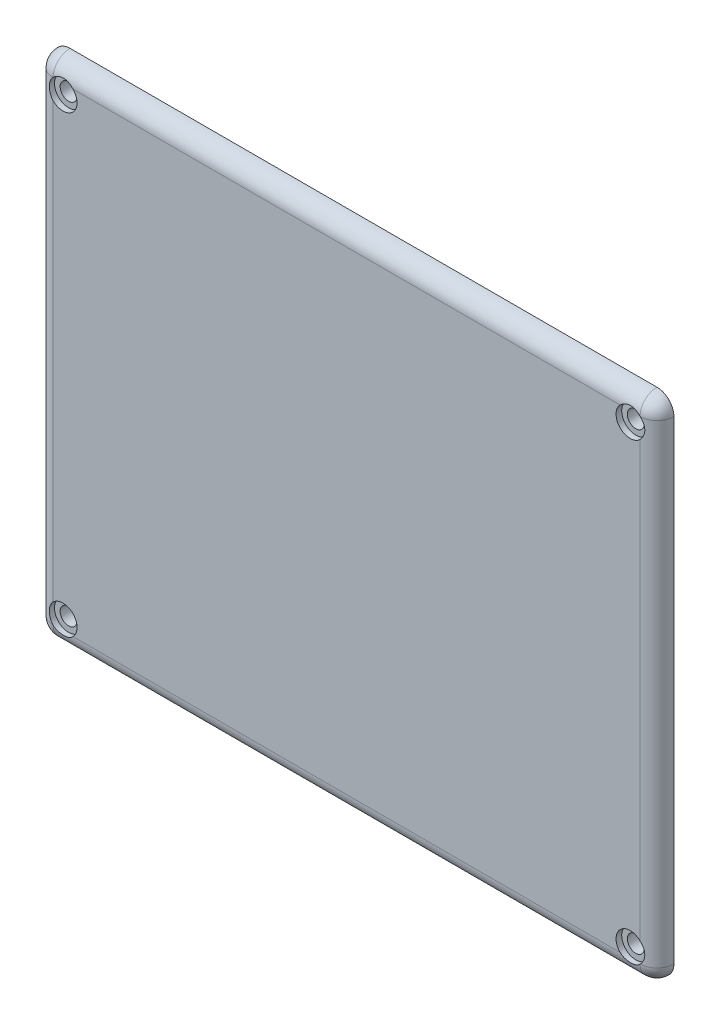
ISO-10303-21;
HEADER;
FILE_DESCRIPTION(('STEP AP214'),'2;1');
FILE_NAME('part.step','',(''),(''),'','','');
FILE_SCHEMA(('AUTOMOTIVE_DESIGN { 1 0 10303 214 1 1 1 1 }'));
ENDSEC;
DATA;
#1=APPLICATION_CONTEXT('core data for automotive mechanical design processes');
#2=APPLICATION_PROTOCOL_DEFINITION('international standard','automotive_design',2000,#1);
#3=PRODUCT_CONTEXT('',#1,'mechanical');
#4=PRODUCT('Part','Part','',(#3));
#5=PRODUCT_RELATED_PRODUCT_CATEGORY('part','',(#4));
#6=PRODUCT_DEFINITION_FORMATION('','',#4);
#7=PRODUCT_DEFINITION_CONTEXT('part definition',#1,'design');
#8=PRODUCT_DEFINITION('design','',#6,#7);
#9=PRODUCT_DEFINITION_SHAPE('','',#8);
#10=(LENGTH_UNIT() NAMED_UNIT(*) SI_UNIT(.MILLI.,.METRE.));
#11=(NAMED_UNIT(*) PLANE_ANGLE_UNIT() SI_UNIT($,.RADIAN.));
#12=(NAMED_UNIT(*) SI_UNIT($,.STERADIAN.) SOLID_ANGLE_UNIT());
#13=UNCERTAINTY_MEASURE_WITH_UNIT(LENGTH_MEASURE(1.E-05),#10,'distance_accuracy_value','');
#14=(GEOMETRIC_REPRESENTATION_CONTEXT(3) GLOBAL_UNCERTAINTY_ASSIGNED_CONTEXT((#13)) GLOBAL_UNIT_ASSIGNED_CONTEXT((#10,
#11,#12)) REPRESENTATION_CONTEXT('',''));
#15=CARTESIAN_POINT('',(0.,0.,0.));
#16=DIRECTION('',(0.,0.,1.));
#17=DIRECTION('',(1.,0.,0.));
#18=AXIS2_PLACEMENT_3D('',#15,#16,#17);
#19=CARTESIAN_POINT('',(-50.25,40.25,0.));
#20=DIRECTION('',(0.,0.,1.));
#21=DIRECTION('',(1.,0.,0.));
#22=AXIS2_PLACEMENT_3D('',#19,#20,#21);
#23=CYLINDRICAL_SURFACE('',#22,1.5);
#24=CARTESIAN_POINT('',(-50.25,40.25,0.));
#25=DIRECTION('',(0.,0.,1.));
#26=DIRECTION('',(1.,0.,0.));
#27=AXIS2_PLACEMENT_3D('',#24,#25,#26);
#28=CIRCLE('',#27,1.5);
#29=CARTESIAN_POINT('',(-48.75,40.25,0.));
#30=VERTEX_POINT('',#29);
#31=EDGE_CURVE('E181',#30,#30,#28,.T.);
#32=ORIENTED_EDGE('',*,*,#31,.F.);
#33=EDGE_LOOP('',(#32));
#34=FACE_BOUND('',#33,.T.);
#35=CARTESIAN_POINT('',(-50.25,40.25,2.));
#36=DIRECTION('',(0.,0.,1.));
#37=DIRECTION('',(1.,0.,0.));
#38=AXIS2_PLACEMENT_3D('',#35,#36,#37);
#39=CIRCLE('',#38,1.5);
#40=CARTESIAN_POINT('',(-48.75,40.25,2.));
#41=VERTEX_POINT('',#40);
#42=EDGE_CURVE('E218',#41,#41,#39,.F.);
#43=ORIENTED_EDGE('',*,*,#42,.F.);
#44=EDGE_LOOP('',(#43));
#45=FACE_BOUND('',#44,.T.);
#46=ADVANCED_FACE('F39',(#34,#45),#23,.F.);
#47=CARTESIAN_POINT('',(50.25,-40.25,0.));
#48=DIRECTION('',(0.,0.,1.));
#49=DIRECTION('',(1.,0.,0.));
#50=AXIS2_PLACEMENT_3D('',#47,#48,#49);
#51=CYLINDRICAL_SURFACE('',#50,1.5);
#52=CARTESIAN_POINT('',(50.25,-40.25,0.));
#53=DIRECTION('',(0.,0.,1.));
#54=DIRECTION('',(1.,0.,0.));
#55=AXIS2_PLACEMENT_3D('',#52,#53,#54);
#56=CIRCLE('',#55,1.5);
#57=CARTESIAN_POINT('',(51.75,-40.25,0.));
#58=VERTEX_POINT('',#57);
#59=EDGE_CURVE('E416',#58,#58,#56,.T.);
#60=ORIENTED_EDGE('',*,*,#59,.F.);
#61=EDGE_LOOP('',(#60));
#62=FACE_BOUND('',#61,.T.);
#63=CARTESIAN_POINT('',(50.25,-40.25,2.));
#64=DIRECTION('',(0.,0.,1.));
#65=DIRECTION('',(1.,0.,0.));
#66=AXIS2_PLACEMENT_3D('',#63,#64,#65);
#67=CIRCLE('',#66,1.5);
#68=CARTESIAN_POINT('',(51.75,-40.25,2.));
#69=VERTEX_POINT('',#68);
#70=EDGE_CURVE('E214',#69,#69,#67,.F.);
#71=ORIENTED_EDGE('',*,*,#70,.F.);
#72=EDGE_LOOP('',(#71));
#73=FACE_BOUND('',#72,.T.);
#74=ADVANCED_FACE('F309',(#62,#73),#51,.F.);
#75=CARTESIAN_POINT('',(-50.25,-40.25,0.));
#76=DIRECTION('',(0.,0.,1.));
#77=DIRECTION('',(1.,0.,0.));
#78=AXIS2_PLACEMENT_3D('',#75,#76,#77);
#79=CYLINDRICAL_SURFACE('',#78,1.5);
#80=CARTESIAN_POINT('',(-50.25,-40.25,0.));
#81=DIRECTION('',(0.,0.,1.));
#82=DIRECTION('',(1.,0.,0.));
#83=AXIS2_PLACEMENT_3D('',#80,#81,#82);
#84=CIRCLE('',#83,1.5);
#85=CARTESIAN_POINT('',(-48.75,-40.25,0.));
#86=VERTEX_POINT('',#85);
#87=EDGE_CURVE('E419',#86,#86,#84,.T.);
#88=ORIENTED_EDGE('',*,*,#87,.F.);
#89=EDGE_LOOP('',(#88));
#90=FACE_BOUND('',#89,.T.);
#91=CARTESIAN_POINT('',(-50.25,-40.25,2.));
#92=DIRECTION('',(0.,0.,1.));
#93=DIRECTION('',(1.,0.,0.));
#94=AXIS2_PLACEMENT_3D('',#91,#92,#93);
#95=CIRCLE('',#94,1.5);
#96=CARTESIAN_POINT('',(-48.75,-40.25,2.));
#97=VERTEX_POINT('',#96);
#98=EDGE_CURVE('E209',#97,#97,#95,.F.);
#99=ORIENTED_EDGE('',*,*,#98,.F.);
#100=EDGE_LOOP('',(#99));
#101=FACE_BOUND('',#100,.T.);
#102=ADVANCED_FACE('F403',(#90,#101),#79,.F.);
#103=CARTESIAN_POINT('',(50.25,40.25,0.));
#104=DIRECTION('',(0.,0.,1.));
#105=DIRECTION('',(1.,0.,0.));
#106=AXIS2_PLACEMENT_3D('',#103,#104,#105);
#107=CYLINDRICAL_SURFACE('',#106,1.5);
#108=CARTESIAN_POINT('',(50.25,40.25,0.));
#109=DIRECTION('',(0.,0.,1.));
#110=DIRECTION('',(1.,0.,0.));
#111=AXIS2_PLACEMENT_3D('',#108,#109,#110);
#112=CIRCLE('',#111,1.5);
#113=CARTESIAN_POINT('',(51.75,40.25,0.));
#114=VERTEX_POINT('',#113);
#115=EDGE_CURVE('E423',#114,#114,#112,.T.);
#116=ORIENTED_EDGE('',*,*,#115,.F.);
#117=EDGE_LOOP('',(#116));
#118=FACE_BOUND('',#117,.T.);
#119=CARTESIAN_POINT('',(50.25,40.25,2.));
#120=DIRECTION('',(0.,0.,1.));
#121=DIRECTION('',(1.,0.,0.));
#122=AXIS2_PLACEMENT_3D('',#119,#120,#121);
#123=CIRCLE('',#122,1.5);
#124=CARTESIAN_POINT('',(51.75,40.25,2.));
#125=VERTEX_POINT('',#124);
#126=EDGE_CURVE('E205',#125,#125,#123,.F.);
#127=ORIENTED_EDGE('',*,*,#126,.F.);
#128=EDGE_LOOP('',(#127));
#129=FACE_BOUND('',#128,.T.);
#130=ADVANCED_FACE('F409',(#118,#129),#107,.F.);
#131=CARTESIAN_POINT('',(52.,-42.,3.));
#132=DIRECTION('',(0.,0.,1.));
#133=DIRECTION('',(1.,0.,0.));
#134=AXIS2_PLACEMENT_3D('',#131,#132,#133);
#135=PLANE('',#134);
#136=CARTESIAN_POINT('',(50.25,40.25,3.));
#137=DIRECTION('',(0.,0.,1.));
#138=DIRECTION('',(1.,0.,0.));
#139=AXIS2_PLACEMENT_3D('',#136,#137,#138);
#140=CIRCLE('',#139,2.5);
#141=CARTESIAN_POINT('',(48.4646428928643,42.,3.));
#142=VERTEX_POINT('',#141);
#143=CARTESIAN_POINT('',(52.,38.4646428928643,3.));
#144=VERTEX_POINT('',#143);
#145=EDGE_CURVE('E69',#142,#144,#140,.T.);
#146=ORIENTED_EDGE('',*,*,#145,.F.);
#147=DIRECTION('',(-1.,0.,0.));
#148=VECTOR('',#147,1.);
#149=CARTESIAN_POINT('',(-52.,42.,3.));
#150=LINE('',#149,#148);
#151=CARTESIAN_POINT('',(-48.4646428928643,42.,3.));
#152=VERTEX_POINT('',#151);
#153=EDGE_CURVE('E149',#142,#152,#150,.T.);
#154=ORIENTED_EDGE('',*,*,#153,.T.);
#155=CARTESIAN_POINT('',(-50.25,40.25,3.));
#156=DIRECTION('',(0.,0.,1.));
#157=DIRECTION('',(1.,0.,0.));
#158=AXIS2_PLACEMENT_3D('',#155,#156,#157);
#159=CIRCLE('',#158,2.5);
#160=CARTESIAN_POINT('',(-52.,38.4646428928643,3.));
#161=VERTEX_POINT('',#160);
#162=EDGE_CURVE('E262',#161,#152,#159,.T.);
#163=ORIENTED_EDGE('',*,*,#162,.F.);
#164=DIRECTION('',(0.,-1.,0.));
#165=VECTOR('',#164,1.);
#166=CARTESIAN_POINT('',(-52.,-42.,3.));
#167=LINE('',#166,#165);
#168=CARTESIAN_POINT('',(-52.,-38.4646428928643,3.));
#169=VERTEX_POINT('',#168);
#170=EDGE_CURVE('E161',#161,#169,#167,.T.);
#171=ORIENTED_EDGE('',*,*,#170,.T.);
#172=CARTESIAN_POINT('',(-50.25,-40.25,3.));
#173=DIRECTION('',(0.,0.,1.));
#174=DIRECTION('',(1.,0.,0.));
#175=AXIS2_PLACEMENT_3D('',#172,#173,#174);
#176=CIRCLE('',#175,2.5);
#177=CARTESIAN_POINT('',(-48.4646428928643,-42.,3.));
#178=VERTEX_POINT('',#177);
#179=EDGE_CURVE('E358',#178,#169,#176,.T.);
#180=ORIENTED_EDGE('',*,*,#179,.F.);
#181=DIRECTION('',(1.,0.,0.));
#182=VECTOR('',#181,1.);
#183=CARTESIAN_POINT('',(52.,-42.,3.));
#184=LINE('',#183,#182);
#185=CARTESIAN_POINT('',(48.4646428928643,-42.,3.));
#186=VERTEX_POINT('',#185);
#187=EDGE_CURVE('E166',#178,#186,#184,.T.);
#188=ORIENTED_EDGE('',*,*,#187,.T.);
#189=CARTESIAN_POINT('',(50.25,-40.25,3.));
#190=DIRECTION('',(0.,0.,1.));
#191=DIRECTION('',(1.,0.,0.));
#192=AXIS2_PLACEMENT_3D('',#189,#190,#191);
#193=CIRCLE('',#192,2.5);
#194=CARTESIAN_POINT('',(52.,-38.4646428928643,3.));
#195=VERTEX_POINT('',#194);
#196=EDGE_CURVE('E374',#195,#186,#193,.T.);
#197=ORIENTED_EDGE('',*,*,#196,.F.);
#198=DIRECTION('',(0.,1.,0.));
#199=VECTOR('',#198,1.);
#200=CARTESIAN_POINT('',(52.,42.,3.));
#201=LINE('',#200,#199);
#202=EDGE_CURVE('E152',#195,#144,#201,.T.);
#203=ORIENTED_EDGE('',*,*,#202,.T.);
#204=EDGE_LOOP('',(#146,#154,#163,#171,#180,#188,#197,#203));
#205=FACE_BOUND('',#204,.T.);
#206=ADVANCED_FACE('F147',(#205),#135,.T.);
#207=CARTESIAN_POINT('',(52.,-42.,0.));
#208=DIRECTION('',(0.,0.,1.));
#209=DIRECTION('',(1.,0.,0.));
#210=AXIS2_PLACEMENT_3D('',#207,#208,#209);
#211=PLANE('',#210);
#212=ORIENTED_EDGE('',*,*,#115,.T.);
#213=EDGE_LOOP('',(#212));
#214=FACE_BOUND('',#213,.T.);
#215=ORIENTED_EDGE('',*,*,#87,.T.);
#216=EDGE_LOOP('',(#215));
#217=FACE_BOUND('',#216,.T.);
#218=ORIENTED_EDGE('',*,*,#59,.T.);
#219=EDGE_LOOP('',(#218));
#220=FACE_BOUND('',#219,.T.);
#221=ORIENTED_EDGE('',*,*,#31,.T.);
#222=EDGE_LOOP('',(#221));
#223=FACE_BOUND('',#222,.T.);
#224=CARTESIAN_POINT('',(52.,-42.,0.));
#225=DIRECTION('',(0.,0.,1.));
#226=DIRECTION('',(1.,0.,0.));
#227=AXIS2_PLACEMENT_3D('',#224,#225,#226);
#228=CIRCLE('',#227,3.);
#229=CARTESIAN_POINT('',(52.,-45.,0.));
#230=VERTEX_POINT('',#229);
#231=CARTESIAN_POINT('',(55.,-42.,0.));
#232=VERTEX_POINT('',#231);
#233=EDGE_CURVE('E204',#230,#232,#228,.T.);
#234=ORIENTED_EDGE('',*,*,#233,.F.);
#235=DIRECTION('',(1.,0.,0.));
#236=VECTOR('',#235,1.);
#237=CARTESIAN_POINT('',(52.,-45.,0.));
#238=LINE('',#237,#236);
#239=CARTESIAN_POINT('',(-52.,-45.,0.));
#240=VERTEX_POINT('',#239);
#241=EDGE_CURVE('E168',#240,#230,#238,.T.);
#242=ORIENTED_EDGE('',*,*,#241,.F.);
#243=CARTESIAN_POINT('',(-52.,-42.,0.));
#244=DIRECTION('',(0.,0.,1.));
#245=DIRECTION('',(-1.,0.,0.));
#246=AXIS2_PLACEMENT_3D('',#243,#244,#245);
#247=CIRCLE('',#246,3.);
#248=CARTESIAN_POINT('',(-55.,-42.,0.));
#249=VERTEX_POINT('',#248);
#250=EDGE_CURVE('E452',#249,#240,#247,.T.);
#251=ORIENTED_EDGE('',*,*,#250,.F.);
#252=DIRECTION('',(0.,-1.,0.));
#253=VECTOR('',#252,1.);
#254=CARTESIAN_POINT('',(-55.,-42.,0.));
#255=LINE('',#254,#253);
#256=CARTESIAN_POINT('',(-55.,42.,0.));
#257=VERTEX_POINT('',#256);
#258=EDGE_CURVE('E448',#257,#249,#255,.T.);
#259=ORIENTED_EDGE('',*,*,#258,.F.);
#260=CARTESIAN_POINT('',(-52.,42.,0.));
#261=DIRECTION('',(0.,0.,1.));
#262=DIRECTION('',(1.,0.,0.));
#263=AXIS2_PLACEMENT_3D('',#260,#261,#262);
#264=CIRCLE('',#263,3.);
#265=CARTESIAN_POINT('',(-52.,45.,0.));
#266=VERTEX_POINT('',#265);
#267=EDGE_CURVE('E444',#266,#257,#264,.T.);
#268=ORIENTED_EDGE('',*,*,#267,.F.);
#269=DIRECTION('',(-1.,0.,0.));
#270=VECTOR('',#269,1.);
#271=CARTESIAN_POINT('',(52.,45.,0.));
#272=LINE('',#271,#270);
#273=CARTESIAN_POINT('',(52.,45.,0.));
#274=VERTEX_POINT('',#273);
#275=EDGE_CURVE('E440',#274,#266,#272,.T.);
#276=ORIENTED_EDGE('',*,*,#275,.F.);
#277=CARTESIAN_POINT('',(52.,42.,0.));
#278=DIRECTION('',(0.,0.,1.));
#279=DIRECTION('',(1.,0.,0.));
#280=AXIS2_PLACEMENT_3D('',#277,#278,#279);
#281=CIRCLE('',#280,3.);
#282=CARTESIAN_POINT('',(55.,42.,0.));
#283=VERTEX_POINT('',#282);
#284=EDGE_CURVE('E436',#283,#274,#281,.T.);
#285=ORIENTED_EDGE('',*,*,#284,.F.);
#286=DIRECTION('',(0.,1.,0.));
#287=VECTOR('',#286,1.);
#288=CARTESIAN_POINT('',(55.,-42.,0.));
#289=LINE('',#288,#287);
#290=EDGE_CURVE('E379',#232,#283,#289,.T.);
#291=ORIENTED_EDGE('',*,*,#290,.F.);
#292=EDGE_LOOP('',(#234,#242,#251,#259,#268,#276,#285,#291));
#293=FACE_BOUND('',#292,.T.);
#294=ADVANCED_FACE('F459',(#214,#217,#220,#223,#293),#211,.F.);
#295=CARTESIAN_POINT('',(52.,42.,0.));
#296=DIRECTION('',(1.,0.,0.));
#297=DIRECTION('',(0.,1.,0.));
#298=AXIS2_PLACEMENT_3D('',#295,#296,#297);
#299=CYLINDRICAL_SURFACE('',#298,3.);
#300=CARTESIAN_POINT('',(52.,42.0353571071358,2.99979163859342));
#301=CARTESIAN_POINT('',(51.9500608667865,42.0843086142766,2.99921283319864));
#302=CARTESIAN_POINT('',(51.8981087732692,42.1311200953269,2.99746505774805));
#303=CARTESIAN_POINT('',(51.7905442012112,42.2201773753236,2.9922419543179));
#304=CARTESIAN_POINT('',(51.7349333149871,42.2624251395385,2.98876737359001));
#305=CARTESIAN_POINT('',(51.5632057627769,42.3818770152372,2.97667351385794));
#306=CARTESIAN_POINT('',(51.4420943301581,42.451887312441,2.96638056967047));
#307=CARTESIAN_POINT('',(51.1900485098685,42.5707188927066,2.9458336116721));
#308=CARTESIAN_POINT('',(51.0591195788686,42.6195518454636,2.93557957951486));
#309=CARTESIAN_POINT('',(50.7907828370971,42.694777132051,2.91869572322499));
#310=CARTESIAN_POINT('',(50.6533792355575,42.7211838385826,2.91206357884415));
#311=CARTESIAN_POINT('',(50.375820665212,42.7507320370624,2.90459041397906));
#312=CARTESIAN_POINT('',(50.2356637535903,42.7538564624348,2.90375364169945));
#313=CARTESIAN_POINT('',(49.9568403102323,42.7366792053536,2.90815683749415));
#314=CARTESIAN_POINT('',(49.8181743899507,42.7163682561252,2.91339920937713));
#315=CARTESIAN_POINT('',(49.5493494902657,42.6536939622346,2.92808440859298));
#316=CARTESIAN_POINT('',(49.4190718569742,42.6118128122909,2.93743475777256));
#317=CARTESIAN_POINT('',(49.1672000307541,42.507456039875,2.95724396602515));
#318=CARTESIAN_POINT('',(49.0456005060231,42.4449931975882,2.96770213447116));
#319=CARTESIAN_POINT('',(48.8453265694204,42.3204596204108,2.98330383209881));
#320=CARTESIAN_POINT('',(48.7639187154389,42.2628244218602,2.98912003323493));
#321=CARTESIAN_POINT('',(48.6084854939142,42.138219611078,2.99746193801563));
#322=CARTESIAN_POINT('',(48.5344565651145,42.0712545394654,2.99998923613827));
#323=CARTESIAN_POINT('',(48.4646428928643,42.,3.));
#324=B_SPLINE_CURVE_WITH_KNOTS('',3,(#300,#301,#302,#303,#304,#305,#306,#307,#308,#309,#310,
#311,#312,#313,#314,#315,#316,#317,#318,#319,#320,#321,#322,#323),.UNSPECIFIED.,.F.,.F.,(4,2,2,
2,2,2,2,2,2,2,2,4),(0.,0.209634674418098,0.41917871114687,0.837853242513011,1.2562967708046,
1.67447192105002,2.0929535754741,2.51160076190603,2.9212711490543,3.33068762958752,
3.6297108007777,3.92858894983611),.UNSPECIFIED.);
#325=CARTESIAN_POINT('',(52.,42.0353571071358,2.99979163859342));
#326=VERTEX_POINT('',#325);
#327=EDGE_CURVE('E133',#326,#142,#324,.T.);
#328=ORIENTED_EDGE('',*,*,#327,.F.);
#329=CARTESIAN_POINT('',(52.,42.,0.));
#330=DIRECTION('',(1.,0.,0.));
#331=DIRECTION('',(0.,0.,-1.));
#332=AXIS2_PLACEMENT_3D('',#329,#330,#331);
#333=CIRCLE('',#332,3.);
#334=EDGE_CURVE('E198',#274,#326,#333,.T.);
#335=ORIENTED_EDGE('',*,*,#334,.F.);
#336=ORIENTED_EDGE('',*,*,#275,.T.);
#337=CARTESIAN_POINT('',(-52.,42.,0.));
#338=DIRECTION('',(-1.,0.,0.));
#339=DIRECTION('',(0.,-1.,0.));
#340=AXIS2_PLACEMENT_3D('',#337,#338,#339);
#341=CIRCLE('',#340,3.);
#342=CARTESIAN_POINT('',(-52.,42.0353571071357,2.99979163859342));
#343=VERTEX_POINT('',#342);
#344=EDGE_CURVE('E201',#343,#266,#341,.T.);
#345=ORIENTED_EDGE('',*,*,#344,.F.);
#346=CARTESIAN_POINT('',(-48.4646428928643,42.,3.));
#347=CARTESIAN_POINT('',(-48.5134814324364,42.0498274806495,2.99999859619542));
#348=CARTESIAN_POINT('',(-48.5643727016704,42.0975703499416,2.99875907176475));
#349=CARTESIAN_POINT('',(-48.6698930094224,42.1885859534983,2.99441325796732));
#350=CARTESIAN_POINT('',(-48.7245202203606,42.2318608478081,2.99130787564966));
#351=CARTESIAN_POINT('',(-48.8933869769346,42.3544991361097,2.98011344457929));
#352=CARTESIAN_POINT('',(-49.0127365670675,42.4268031957028,2.97014303498068));
#353=CARTESIAN_POINT('',(-49.2615731305192,42.5505065597071,2.94972736978609));
#354=CARTESIAN_POINT('',(-49.3910520358303,42.6019223035257,2.9392824948278));
#355=CARTESIAN_POINT('',(-49.6569233553629,42.6825969578046,2.92160568474614));
#356=CARTESIAN_POINT('',(-49.7933122297122,42.7118670930838,2.91437212269219));
#357=CARTESIAN_POINT('',(-50.0700654908009,42.7474385749668,2.90545838599251));
#358=CARTESIAN_POINT('',(-50.210448486436,42.7536043592303,2.90381099294785));
#359=CARTESIAN_POINT('',(-50.4902421287338,42.7423663449879,2.90670289565939));
#360=CARTESIAN_POINT('',(-50.6296524798289,42.7249556709676,2.91124399614529));
#361=CARTESIAN_POINT('',(-50.8999941658302,42.6678797580177,2.92485152913564));
#362=CARTESIAN_POINT('',(-51.031049387737,42.6287678733732,2.93380484461675));
#363=CARTESIAN_POINT('',(-51.2849051506309,42.5298058488742,2.95327481733971));
#364=CARTESIAN_POINT('',(-51.4077097797255,42.46996607138,2.96379069192439));
#365=CARTESIAN_POINT('',(-51.6109194430326,42.3495026576022,2.98001480213467));
#366=CARTESIAN_POINT('',(-51.6939296176434,42.2932987188332,2.98625835478941));
#367=CARTESIAN_POINT('',(-51.8526759549534,42.1713191008928,2.9957254556576));
#368=CARTESIAN_POINT('',(-51.9284170478255,42.105549986444,2.9989510639353));
#369=CARTESIAN_POINT('',(-52.,42.0353571071357,2.99979163859342));
#370=B_SPLINE_CURVE_WITH_KNOTS('',3,(#346,#347,#348,#349,#350,#351,#352,#353,#354,#355,#356,
#357,#358,#359,#360,#361,#362,#363,#364,#365,#366,#367,#368,#369),.UNSPECIFIED.,.F.,.F.,(4,2,2,
2,2,2,2,2,2,2,2,4),(0.,0.209148934394972,0.418196277433579,0.835763446092833,1.25300134372409,
1.67002761640909,2.08949694952745,2.50908863726791,2.91844270039925,3.32759241247429,
3.62819506443365,3.92859237346132),.UNSPECIFIED.);
#371=EDGE_CURVE('E159',#152,#343,#370,.T.);
#372=ORIENTED_EDGE('',*,*,#371,.F.);
#373=ORIENTED_EDGE('',*,*,#153,.F.);
#374=EDGE_LOOP('',(#328,#335,#336,#345,#372,#373));
#375=FACE_BOUND('',#374,.T.);
#376=ADVANCED_FACE('F41',(#375),#299,.T.);
#377=CARTESIAN_POINT('',(-52.,42.,0.));
#378=DIRECTION('',(0.,0.,1.));
#379=DIRECTION('',(1.,0.,0.));
#380=AXIS2_PLACEMENT_3D('',#377,#378,#379);
#381=SPHERICAL_SURFACE('',#380,3.);
#382=CARTESIAN_POINT('',(-51.9998,42.0355531243848,2.99978931515973));
#383=CARTESIAN_POINT('',(-52.0058191145801,42.0296545308366,2.99985962279687));
#384=CARTESIAN_POINT('',(-52.0118080989023,42.0237258070305,2.99989477661544));
#385=CARTESIAN_POINT('',(-52.0237258070305,42.0118080989022,2.99989477661544));
#386=CARTESIAN_POINT('',(-52.0296545308366,42.0058191145801,2.99985962279687));
#387=CARTESIAN_POINT('',(-52.0355531243848,41.9998,2.99978931515973));
#388=B_SPLINE_CURVE_WITH_KNOTS('',3,(#382,#383,#384,#385,#386,#387),.UNSPECIFIED.,.F.,.F.,(4,2,
4),(0.,0.0252818198462741,0.0505636396925482),.UNSPECIFIED.);
#389=CARTESIAN_POINT('',(-52.0353571071357,42.,2.99979163859342));
#390=VERTEX_POINT('',#389);
#391=EDGE_CURVE('E61',#343,#390,#388,.T.);
#392=ORIENTED_EDGE('',*,*,#391,.F.);
#393=ORIENTED_EDGE('',*,*,#344,.T.);
#394=ORIENTED_EDGE('',*,*,#267,.T.);
#395=CARTESIAN_POINT('',(-52.,42.,0.));
#396=DIRECTION('',(0.,-1.,0.));
#397=DIRECTION('',(1.,0.,0.));
#398=AXIS2_PLACEMENT_3D('',#395,#396,#397);
#399=CIRCLE('',#398,3.);
#400=EDGE_CURVE('E195',#390,#257,#399,.T.);
#401=ORIENTED_EDGE('',*,*,#400,.F.);
#402=EDGE_LOOP('',(#392,#393,#394,#401));
#403=FACE_BOUND('',#402,.T.);
#404=ADVANCED_FACE('F329',(#403),#381,.T.);
#405=CARTESIAN_POINT('',(52.,42.,0.));
#406=DIRECTION('',(0.,0.,1.));
#407=DIRECTION('',(1.,0.,0.));
#408=AXIS2_PLACEMENT_3D('',#405,#406,#407);
#409=SPHERICAL_SURFACE('',#408,3.);
#410=CARTESIAN_POINT('',(52.0355531243847,41.9998,2.99978931515973));
#411=CARTESIAN_POINT('',(52.0296545308366,42.0058191145801,2.99985962279687));
#412=CARTESIAN_POINT('',(52.0237258070305,42.0118080989023,2.99989477661544));
#413=CARTESIAN_POINT('',(52.0118080989023,42.0237258070305,2.99989477661544));
#414=CARTESIAN_POINT('',(52.0058191145801,42.0296545308366,2.99985962279687));
#415=CARTESIAN_POINT('',(51.9998,42.0355531243848,2.99978931515973));
#416=B_SPLINE_CURVE_WITH_KNOTS('',3,(#410,#411,#412,#413,#414,#415),.UNSPECIFIED.,.F.,.F.,(4,2,
4),(0.,0.0252818198462741,0.0505636396925384),.UNSPECIFIED.);
#417=CARTESIAN_POINT('',(52.0353571071358,42.,2.99979163859342));
#418=VERTEX_POINT('',#417);
#419=EDGE_CURVE('E137',#418,#326,#416,.T.);
#420=ORIENTED_EDGE('',*,*,#419,.F.);
#421=CARTESIAN_POINT('',(52.,42.,0.));
#422=DIRECTION('',(0.,-1.,0.));
#423=DIRECTION('',(1.,0.,0.));
#424=AXIS2_PLACEMENT_3D('',#421,#422,#423);
#425=CIRCLE('',#424,3.);
#426=EDGE_CURVE('E191',#283,#418,#425,.T.);
#427=ORIENTED_EDGE('',*,*,#426,.F.);
#428=ORIENTED_EDGE('',*,*,#284,.T.);
#429=ORIENTED_EDGE('',*,*,#334,.T.);
#430=EDGE_LOOP('',(#420,#427,#428,#429));
#431=FACE_BOUND('',#430,.T.);
#432=ADVANCED_FACE('F333',(#431),#409,.T.);
#433=CARTESIAN_POINT('',(-52.,-42.,0.));
#434=DIRECTION('',(0.,1.,0.));
#435=DIRECTION('',(-1.,0.,0.));
#436=AXIS2_PLACEMENT_3D('',#433,#434,#435);
#437=CYLINDRICAL_SURFACE('',#436,3.);
#438=CARTESIAN_POINT('',(-52.,-38.4646428928643,3.));
#439=CARTESIAN_POINT('',(-52.0498274806495,-38.5134814324364,2.99999859619542));
#440=CARTESIAN_POINT('',(-52.0975703499416,-38.5643727016704,2.99875907176475));
#441=CARTESIAN_POINT('',(-52.1885859534984,-38.6698930094224,2.99441325796732));
#442=CARTESIAN_POINT('',(-52.2318608478081,-38.7245202203606,2.99130787564966));
#443=CARTESIAN_POINT('',(-52.3544991361097,-38.8933869769347,2.98011344457929));
#444=CARTESIAN_POINT('',(-52.4268031957028,-39.0127365670675,2.97014303498068));
#445=CARTESIAN_POINT('',(-52.5505065597071,-39.2615731305193,2.94972736978609));
#446=CARTESIAN_POINT('',(-52.6019223035257,-39.3910520358304,2.9392824948278));
#447=CARTESIAN_POINT('',(-52.6825969578046,-39.656923355363,2.92160568474614));
#448=CARTESIAN_POINT('',(-52.7118670930838,-39.7933122297123,2.91437212269219));
#449=CARTESIAN_POINT('',(-52.7474385749668,-40.0700654908009,2.90545838599252));
#450=CARTESIAN_POINT('',(-52.7536043592303,-40.2104484864361,2.90381099294786));
#451=CARTESIAN_POINT('',(-52.7423663449879,-40.4902421287339,2.9067028956594));
#452=CARTESIAN_POINT('',(-52.7249556709676,-40.6296524798289,2.91124399614531));
#453=CARTESIAN_POINT('',(-52.6678797580177,-40.8999941658303,2.92485152913565));
#454=CARTESIAN_POINT('',(-52.6287678733732,-41.0310493877371,2.93380484461676));
#455=CARTESIAN_POINT('',(-52.5298058488742,-41.2849051506309,2.95327481733972));
#456=CARTESIAN_POINT('',(-52.4699660713799,-41.4077097797256,2.9637906919244));
#457=CARTESIAN_POINT('',(-52.3495026576022,-41.6109194430326,2.98001480213468));
#458=CARTESIAN_POINT('',(-52.2932987188331,-41.6939296176435,2.98625835478942));
#459=CARTESIAN_POINT('',(-52.1713191008928,-41.8526759549534,2.9957254556576));
#460=CARTESIAN_POINT('',(-52.105549986444,-41.9284170478255,2.99895106393531));
#461=CARTESIAN_POINT('',(-52.0353571071357,-42.,2.99979163859342));
#462=B_SPLINE_CURVE_WITH_KNOTS('',3,(#438,#439,#440,#441,#442,#443,#444,#445,#446,#447,#448,
#449,#450,#451,#452,#453,#454,#455,#456,#457,#458,#459,#460,#461),.UNSPECIFIED.,.F.,.F.,(4,2,2,
2,2,2,2,2,2,2,2,4),(0.,0.209148934394967,0.418196277433571,0.83576344609284,1.25300134372412,
1.6700276164091,2.08949694952746,2.50908863726791,2.91844270039925,3.32759241247429,
3.62819506443362,3.92859237346127),.UNSPECIFIED.);
#463=CARTESIAN_POINT('',(-52.0353571071357,-42.,2.99979163859342));
#464=VERTEX_POINT('',#463);
#465=EDGE_CURVE('E288',#169,#464,#462,.T.);
#466=ORIENTED_EDGE('',*,*,#465,.F.);
#467=ORIENTED_EDGE('',*,*,#170,.F.);
#468=CARTESIAN_POINT('',(-52.0353571071358,42.,2.99979163859342));
#469=CARTESIAN_POINT('',(-52.0843086142765,41.9500608667865,2.99921283319864));
#470=CARTESIAN_POINT('',(-52.1311200953269,41.8981087732692,2.99746505774805));
#471=CARTESIAN_POINT('',(-52.2201773753236,41.7905442012112,2.99224195431791));
#472=CARTESIAN_POINT('',(-52.2624251395384,41.7349333149871,2.98876737359002));
#473=CARTESIAN_POINT('',(-52.3818770152372,41.5632057627769,2.97667351385795));
#474=CARTESIAN_POINT('',(-52.451887312441,41.4420943301581,2.96638056967047));
#475=CARTESIAN_POINT('',(-52.5707188927066,41.1900485098685,2.9458336116721));
#476=CARTESIAN_POINT('',(-52.6195518454636,41.0591195788686,2.93557957951487));
#477=CARTESIAN_POINT('',(-52.694777132051,40.7907828370971,2.91869572322499));
#478=CARTESIAN_POINT('',(-52.7211838385826,40.6533792355575,2.91206357884416));
#479=CARTESIAN_POINT('',(-52.7507320370624,40.375820665212,2.90459041397907));
#480=CARTESIAN_POINT('',(-52.7538564624348,40.2356637535903,2.90375364169945));
#481=CARTESIAN_POINT('',(-52.7366792053535,39.9568403102323,2.90815683749416));
#482=CARTESIAN_POINT('',(-52.7163682561252,39.8181743899507,2.91339920937713));
#483=CARTESIAN_POINT('',(-52.6536939622345,39.5493494902657,2.92808440859299));
#484=CARTESIAN_POINT('',(-52.6118128122909,39.4190718569742,2.93743475777256));
#485=CARTESIAN_POINT('',(-52.507456039875,39.1672000307541,2.95724396602515));
#486=CARTESIAN_POINT('',(-52.4449931975882,39.0456005060231,2.96770213447116));
#487=CARTESIAN_POINT('',(-52.3204596204108,38.8453265694204,2.98330383209881));
#488=CARTESIAN_POINT('',(-52.2628244218602,38.7639187154389,2.98912003323493));
#489=CARTESIAN_POINT('',(-52.138219611078,38.6084854939143,2.99746193801563));
#490=CARTESIAN_POINT('',(-52.0712545394654,38.5344565651146,2.99998923613827));
#491=CARTESIAN_POINT('',(-52.,38.4646428928643,3.));
#492=B_SPLINE_CURVE_WITH_KNOTS('',3,(#468,#469,#470,#471,#472,#473,#474,#475,#476,#477,#478,
#479,#480,#481,#482,#483,#484,#485,#486,#487,#488,#489,#490,#491),.UNSPECIFIED.,.F.,.F.,(4,2,2,
2,2,2,2,2,2,2,2,4),(0.,0.209634674418083,0.419178711146865,0.837853242513008,1.25629677080459,
1.67447192105002,2.0929535754741,2.51160076190602,2.9212711490543,3.33068762958752,
3.62971080077768,3.92858894983608),.UNSPECIFIED.);
#493=EDGE_CURVE('E11',#390,#161,#492,.T.);
#494=ORIENTED_EDGE('',*,*,#493,.F.);
#495=ORIENTED_EDGE('',*,*,#400,.T.);
#496=ORIENTED_EDGE('',*,*,#258,.T.);
#497=CARTESIAN_POINT('',(-52.,-42.,0.));
#498=DIRECTION('',(0.,-1.,0.));
#499=DIRECTION('',(0.,0.,-1.));
#500=AXIS2_PLACEMENT_3D('',#497,#498,#499);
#501=CIRCLE('',#500,3.);
#502=EDGE_CURVE('E188',#464,#249,#501,.T.);
#503=ORIENTED_EDGE('',*,*,#502,.F.);
#504=EDGE_LOOP('',(#466,#467,#494,#495,#496,#503));
#505=FACE_BOUND('',#504,.T.);
#506=ADVANCED_FACE('F337',(#505),#437,.T.);
#507=CARTESIAN_POINT('',(52.,-42.,0.));
#508=DIRECTION('',(0.,-1.,0.));
#509=DIRECTION('',(0.,0.,-1.));
#510=AXIS2_PLACEMENT_3D('',#507,#508,#509);
#511=CYLINDRICAL_SURFACE('',#510,3.);
#512=CARTESIAN_POINT('',(52.,38.4646428928643,3.));
#513=CARTESIAN_POINT('',(52.0498274806495,38.5134814324364,2.99999859619542));
#514=CARTESIAN_POINT('',(52.0975703499416,38.5643727016704,2.99875907176475));
#515=CARTESIAN_POINT('',(52.1885859534983,38.6698930094224,2.99441325796732));
#516=CARTESIAN_POINT('',(52.2318608478081,38.7245202203606,2.99130787564966));
#517=CARTESIAN_POINT('',(52.3544991361097,38.8933869769347,2.98011344457929));
#518=CARTESIAN_POINT('',(52.4268031957028,39.0127365670675,2.97014303498068));
#519=CARTESIAN_POINT('',(52.5505065597071,39.2615731305193,2.94972736978609));
#520=CARTESIAN_POINT('',(52.6019223035257,39.3910520358304,2.9392824948278));
#521=CARTESIAN_POINT('',(52.6825969578046,39.656923355363,2.92160568474614));
#522=CARTESIAN_POINT('',(52.7118670930838,39.7933122297123,2.91437212269219));
#523=CARTESIAN_POINT('',(52.7474385749668,40.0700654908009,2.90545838599252));
#524=CARTESIAN_POINT('',(52.7536043592303,40.210448486436,2.90381099294785));
#525=CARTESIAN_POINT('',(52.7423663449879,40.4902421287339,2.90670289565939));
#526=CARTESIAN_POINT('',(52.7249556709676,40.6296524798289,2.9112439961453));
#527=CARTESIAN_POINT('',(52.6678797580177,40.8999941658303,2.92485152913564));
#528=CARTESIAN_POINT('',(52.6287678733732,41.0310493877371,2.93380484461676));
#529=CARTESIAN_POINT('',(52.5298058488742,41.2849051506309,2.95327481733972));
#530=CARTESIAN_POINT('',(52.4699660713799,41.4077097797256,2.9637906919244));
#531=CARTESIAN_POINT('',(52.3495026576022,41.6109194430326,2.98001480213467));
#532=CARTESIAN_POINT('',(52.2932987188332,41.6939296176434,2.98625835478941));
#533=CARTESIAN_POINT('',(52.1713191008928,41.8526759549534,2.9957254556576));
#534=CARTESIAN_POINT('',(52.105549986444,41.9284170478255,2.9989510639353));
#535=CARTESIAN_POINT('',(52.0353571071358,42.,2.99979163859342));
#536=B_SPLINE_CURVE_WITH_KNOTS('',3,(#512,#513,#514,#515,#516,#517,#518,#519,#520,#521,#522,
#523,#524,#525,#526,#527,#528,#529,#530,#531,#532,#533,#534,#535),.UNSPECIFIED.,.F.,.F.,(4,2,2,
2,2,2,2,2,2,2,2,4),(0.,0.209148934394957,0.418196277433565,0.835763446092824,1.2530013437241,
1.67002761640908,2.08949694952744,2.50908863726789,2.91844270039924,3.32759241247428,
3.6281950644336,3.92859237346124),.UNSPECIFIED.);
#537=EDGE_CURVE('E55',#144,#418,#536,.T.);
#538=ORIENTED_EDGE('',*,*,#537,.F.);
#539=ORIENTED_EDGE('',*,*,#202,.F.);
#540=CARTESIAN_POINT('',(52.0353571071358,-42.,2.99979163859342));
#541=CARTESIAN_POINT('',(52.0843086142765,-41.9500608667865,2.99921283319864));
#542=CARTESIAN_POINT('',(52.1311200953269,-41.8981087732692,2.99746505774805));
#543=CARTESIAN_POINT('',(52.2201773753236,-41.7905442012112,2.9922419543179));
#544=CARTESIAN_POINT('',(52.2624251395384,-41.7349333149871,2.98876737359001));
#545=CARTESIAN_POINT('',(52.3818770152372,-41.5632057627769,2.97667351385794));
#546=CARTESIAN_POINT('',(52.451887312441,-41.442094330158,2.96638056967047));
#547=CARTESIAN_POINT('',(52.5707188927066,-41.1900485098684,2.9458336116721));
#548=CARTESIAN_POINT('',(52.6195518454636,-41.0591195788686,2.93557957951486));
#549=CARTESIAN_POINT('',(52.694777132051,-40.7907828370971,2.91869572322499));
#550=CARTESIAN_POINT('',(52.7211838385826,-40.6533792355575,2.91206357884415));
#551=CARTESIAN_POINT('',(52.7507320370624,-40.3758206652119,2.90459041397907));
#552=CARTESIAN_POINT('',(52.7538564624348,-40.2356637535903,2.90375364169945));
#553=CARTESIAN_POINT('',(52.7366792053535,-39.9568403102322,2.90815683749416));
#554=CARTESIAN_POINT('',(52.7163682561251,-39.8181743899507,2.91339920937713));
#555=CARTESIAN_POINT('',(52.6536939622345,-39.5493494902657,2.92808440859299));
#556=CARTESIAN_POINT('',(52.6118128122909,-39.4190718569742,2.93743475777256));
#557=CARTESIAN_POINT('',(52.507456039875,-39.1672000307541,2.95724396602515));
#558=CARTESIAN_POINT('',(52.4449931975882,-39.0456005060231,2.96770213447116));
#559=CARTESIAN_POINT('',(52.3204596204108,-38.8453265694204,2.98330383209881));
#560=CARTESIAN_POINT('',(52.2628244218602,-38.7639187154389,2.98912003323493));
#561=CARTESIAN_POINT('',(52.138219611078,-38.6084854939142,2.99746193801563));
#562=CARTESIAN_POINT('',(52.0712545394654,-38.5344565651145,2.99998923613827));
#563=CARTESIAN_POINT('',(52.,-38.4646428928643,3.));
#564=B_SPLINE_CURVE_WITH_KNOTS('',3,(#540,#541,#542,#543,#544,#545,#546,#547,#548,#549,#550,
#551,#552,#553,#554,#555,#556,#557,#558,#559,#560,#561,#562,#563),.UNSPECIFIED.,.F.,.F.,(4,2,2,
2,2,2,2,2,2,2,2,4),(0.,0.209634674418093,0.419178711146875,0.837853242513022,1.25629677080461,
1.67447192105004,2.09295357547411,2.51160076190604,2.92127114905431,3.33068762958753,
3.62971080077768,3.92858894983607),.UNSPECIFIED.);
#565=CARTESIAN_POINT('',(52.0353571071358,-42.,2.99979163859342));
#566=VERTEX_POINT('',#565);
#567=EDGE_CURVE('E261',#566,#195,#564,.T.);
#568=ORIENTED_EDGE('',*,*,#567,.F.);
#569=CARTESIAN_POINT('',(52.,-42.,0.));
#570=DIRECTION('',(0.,-1.,0.));
#571=DIRECTION('',(0.,0.,-1.));
#572=AXIS2_PLACEMENT_3D('',#569,#570,#571);
#573=CIRCLE('',#572,3.);
#574=EDGE_CURVE('E184',#232,#566,#573,.T.);
#575=ORIENTED_EDGE('',*,*,#574,.F.);
#576=ORIENTED_EDGE('',*,*,#290,.T.);
#577=ORIENTED_EDGE('',*,*,#426,.T.);
#578=EDGE_LOOP('',(#538,#539,#568,#575,#576,#577));
#579=FACE_BOUND('',#578,.T.);
#580=ADVANCED_FACE('F278',(#579),#511,.T.);
#581=CARTESIAN_POINT('',(-52.,-42.,0.));
#582=DIRECTION('',(0.,0.,1.));
#583=DIRECTION('',(1.,0.,0.));
#584=AXIS2_PLACEMENT_3D('',#581,#582,#583);
#585=SPHERICAL_SURFACE('',#584,3.);
#586=CARTESIAN_POINT('',(-52.0355531243847,-41.9998,2.99978931515973));
#587=CARTESIAN_POINT('',(-52.0296545308366,-42.0058191145801,2.99985962279687));
#588=CARTESIAN_POINT('',(-52.0237258070305,-42.0118080989023,2.99989477661544));
#589=CARTESIAN_POINT('',(-52.0118080989022,-42.0237258070305,2.99989477661544));
#590=CARTESIAN_POINT('',(-52.0058191145801,-42.0296545308366,2.99985962279687));
#591=CARTESIAN_POINT('',(-51.9998,-42.0355531243847,2.99978931515973));
#592=B_SPLINE_CURVE_WITH_KNOTS('',3,(#586,#587,#588,#589,#590,#591),.UNSPECIFIED.,.F.,.F.,(4,2,
4),(0.,0.0252818198462446,0.0505636396924893),.UNSPECIFIED.);
#593=CARTESIAN_POINT('',(-52.,-42.0353571071357,2.99979163859342));
#594=VERTEX_POINT('',#593);
#595=EDGE_CURVE('E281',#464,#594,#592,.T.);
#596=ORIENTED_EDGE('',*,*,#595,.F.);
#597=ORIENTED_EDGE('',*,*,#502,.T.);
#598=ORIENTED_EDGE('',*,*,#250,.T.);
#599=CARTESIAN_POINT('',(-52.,-42.,0.));
#600=DIRECTION('',(1.,0.,0.));
#601=DIRECTION('',(0.,1.,0.));
#602=AXIS2_PLACEMENT_3D('',#599,#600,#601);
#603=CIRCLE('',#602,3.);
#604=EDGE_CURVE('E180',#594,#240,#603,.T.);
#605=ORIENTED_EDGE('',*,*,#604,.F.);
#606=EDGE_LOOP('',(#596,#597,#598,#605));
#607=FACE_BOUND('',#606,.T.);
#608=ADVANCED_FACE('F274',(#607),#585,.T.);
#609=CARTESIAN_POINT('',(52.,-42.,0.));
#610=DIRECTION('',(0.,0.,1.));
#611=DIRECTION('',(1.,0.,0.));
#612=AXIS2_PLACEMENT_3D('',#609,#610,#611);
#613=SPHERICAL_SURFACE('',#612,3.);
#614=CARTESIAN_POINT('',(51.9998,-42.0355531243847,2.99978931515973));
#615=CARTESIAN_POINT('',(52.0058191145801,-42.0296545308366,2.99985962279687));
#616=CARTESIAN_POINT('',(52.0118080989023,-42.0237258070305,2.99989477661544));
#617=CARTESIAN_POINT('',(52.0237258070305,-42.0118080989022,2.99989477661544));
#618=CARTESIAN_POINT('',(52.0296545308366,-42.0058191145801,2.99985962279687));
#619=CARTESIAN_POINT('',(52.0355531243847,-41.9998,2.99978931515973));
#620=B_SPLINE_CURVE_WITH_KNOTS('',3,(#614,#615,#616,#617,#618,#619),.UNSPECIFIED.,.F.,.F.,(4,2,
4),(0.,0.0252818198462692,0.0505636396925384),.UNSPECIFIED.);
#621=CARTESIAN_POINT('',(52.,-42.0353571071357,2.99979163859342));
#622=VERTEX_POINT('',#621);
#623=EDGE_CURVE('E222',#622,#566,#620,.T.);
#624=ORIENTED_EDGE('',*,*,#623,.F.);
#625=CARTESIAN_POINT('',(52.,-42.,0.));
#626=DIRECTION('',(-1.,0.,0.));
#627=DIRECTION('',(0.,-1.,0.));
#628=AXIS2_PLACEMENT_3D('',#625,#626,#627);
#629=CIRCLE('',#628,3.);
#630=EDGE_CURVE('E176',#230,#622,#629,.T.);
#631=ORIENTED_EDGE('',*,*,#630,.F.);
#632=ORIENTED_EDGE('',*,*,#233,.T.);
#633=ORIENTED_EDGE('',*,*,#574,.T.);
#634=EDGE_LOOP('',(#624,#631,#632,#633));
#635=FACE_BOUND('',#634,.T.);
#636=ADVANCED_FACE('F270',(#635),#613,.T.);
#637=CARTESIAN_POINT('',(52.,-42.,0.));
#638=DIRECTION('',(-1.,0.,0.));
#639=DIRECTION('',(0.,-1.,0.));
#640=AXIS2_PLACEMENT_3D('',#637,#638,#639);
#641=CYLINDRICAL_SURFACE('',#640,3.);
#642=CARTESIAN_POINT('',(-52.,-42.0353571071357,2.99979163859342));
#643=CARTESIAN_POINT('',(-51.9500608667866,-42.0843086142765,2.99921283319864));
#644=CARTESIAN_POINT('',(-51.8981087732692,-42.1311200953269,2.99746505774806));
#645=CARTESIAN_POINT('',(-51.7905442012113,-42.2201773753236,2.99224195431791));
#646=CARTESIAN_POINT('',(-51.7349333149872,-42.2624251395384,2.98876737359002));
#647=CARTESIAN_POINT('',(-51.563205762777,-42.3818770152372,2.97667351385795));
#648=CARTESIAN_POINT('',(-51.4420943301581,-42.451887312441,2.96638056967048));
#649=CARTESIAN_POINT('',(-51.1900485098685,-42.5707188927065,2.9458336116721));
#650=CARTESIAN_POINT('',(-51.0591195788687,-42.6195518454636,2.93557957951487));
#651=CARTESIAN_POINT('',(-50.7907828370972,-42.6947771320509,2.91869572322499));
#652=CARTESIAN_POINT('',(-50.6533792355576,-42.7211838385826,2.91206357884416));
#653=CARTESIAN_POINT('',(-50.375820665212,-42.7507320370624,2.90459041397907));
#654=CARTESIAN_POINT('',(-50.2356637535903,-42.7538564624348,2.90375364169945));
#655=CARTESIAN_POINT('',(-49.9568403102323,-42.7366792053536,2.90815683749416));
#656=CARTESIAN_POINT('',(-49.8181743899508,-42.7163682561252,2.91339920937713));
#657=CARTESIAN_POINT('',(-49.5493494902658,-42.6536939622346,2.92808440859298));
#658=CARTESIAN_POINT('',(-49.4190718569743,-42.6118128122909,2.93743475777256));
#659=CARTESIAN_POINT('',(-49.1672000307542,-42.507456039875,2.95724396602514));
#660=CARTESIAN_POINT('',(-49.0456005060232,-42.4449931975882,2.96770213447116));
#661=CARTESIAN_POINT('',(-48.8453265694204,-42.3204596204109,2.98330383209881));
#662=CARTESIAN_POINT('',(-48.763918715439,-42.2628244218602,2.98912003323493));
#663=CARTESIAN_POINT('',(-48.6084854939143,-42.138219611078,2.99746193801563));
#664=CARTESIAN_POINT('',(-48.5344565651146,-42.0712545394654,2.99998923613827));
#665=CARTESIAN_POINT('',(-48.4646428928643,-42.,3.));
#666=B_SPLINE_CURVE_WITH_KNOTS('',3,(#642,#643,#644,#645,#646,#647,#648,#649,#650,#651,#652,
#653,#654,#655,#656,#657,#658,#659,#660,#661,#662,#663,#664,#665),.UNSPECIFIED.,.F.,.F.,(4,2,2,
2,2,2,2,2,2,2,2,4),(0.,0.209634674418088,0.419178711146864,0.837853242513004,1.25629677080459,
1.67447192105001,2.09295357547408,2.51160076190602,2.92127114905429,3.33068762958751,
3.6297108007777,3.92858894983613),.UNSPECIFIED.);
#667=EDGE_CURVE('E231',#594,#178,#666,.T.);
#668=ORIENTED_EDGE('',*,*,#667,.F.);
#669=ORIENTED_EDGE('',*,*,#604,.T.);
#670=ORIENTED_EDGE('',*,*,#241,.T.);
#671=ORIENTED_EDGE('',*,*,#630,.T.);
#672=CARTESIAN_POINT('',(48.4646428928643,-42.,3.));
#673=CARTESIAN_POINT('',(48.5134814324364,-42.0498274806495,2.99999859619542));
#674=CARTESIAN_POINT('',(48.5643727016704,-42.0975703499416,2.99875907176475));
#675=CARTESIAN_POINT('',(48.6698930094223,-42.1885859534983,2.99441325796732));
#676=CARTESIAN_POINT('',(48.7245202203606,-42.2318608478081,2.99130787564966));
#677=CARTESIAN_POINT('',(48.8933869769346,-42.3544991361097,2.98011344457929));
#678=CARTESIAN_POINT('',(49.0127365670675,-42.4268031957028,2.97014303498068));
#679=CARTESIAN_POINT('',(49.2615731305192,-42.5505065597071,2.94972736978609));
#680=CARTESIAN_POINT('',(49.3910520358303,-42.6019223035257,2.9392824948278));
#681=CARTESIAN_POINT('',(49.656923355363,-42.6825969578046,2.92160568474614));
#682=CARTESIAN_POINT('',(49.7933122297122,-42.7118670930838,2.91437212269219));
#683=CARTESIAN_POINT('',(50.0700654908009,-42.7474385749668,2.90545838599251));
#684=CARTESIAN_POINT('',(50.210448486436,-42.7536043592303,2.90381099294785));
#685=CARTESIAN_POINT('',(50.4902421287338,-42.7423663449879,2.90670289565939));
#686=CARTESIAN_POINT('',(50.6296524798289,-42.7249556709676,2.9112439961453));
#687=CARTESIAN_POINT('',(50.8999941658302,-42.6678797580177,2.92485152913564));
#688=CARTESIAN_POINT('',(51.031049387737,-42.6287678733732,2.93380484461675));
#689=CARTESIAN_POINT('',(51.2849051506309,-42.5298058488742,2.95327481733972));
#690=CARTESIAN_POINT('',(51.4077097797255,-42.4699660713799,2.96379069192439));
#691=CARTESIAN_POINT('',(51.6109194430326,-42.3495026576022,2.98001480213467));
#692=CARTESIAN_POINT('',(51.6939296176434,-42.2932987188332,2.98625835478941));
#693=CARTESIAN_POINT('',(51.8526759549534,-42.1713191008928,2.9957254556576));
#694=CARTESIAN_POINT('',(51.9284170478255,-42.105549986444,2.9989510639353));
#695=CARTESIAN_POINT('',(52.,-42.0353571071357,2.99979163859342));
#696=B_SPLINE_CURVE_WITH_KNOTS('',3,(#672,#673,#674,#675,#676,#677,#678,#679,#680,#681,#682,
#683,#684,#685,#686,#687,#688,#689,#690,#691,#692,#693,#694,#695),.UNSPECIFIED.,.F.,.F.,(4,2,2,
2,2,2,2,2,2,2,2,4),(0.,0.209148934394962,0.41819627743358,0.835763446092833,1.25300134372411,
1.67002761640909,2.08949694952745,2.50908863726791,2.91844270039924,3.32759241247428,
3.62819506443363,3.92859237346129),.UNSPECIFIED.);
#697=EDGE_CURVE('E175',#186,#622,#696,.T.);
#698=ORIENTED_EDGE('',*,*,#697,.F.);
#699=ORIENTED_EDGE('',*,*,#187,.F.);
#700=EDGE_LOOP('',(#668,#669,#670,#671,#698,#699));
#701=FACE_BOUND('',#700,.T.);
#702=ADVANCED_FACE('F237',(#701),#641,.T.);
#703=CARTESIAN_POINT('',(50.25,40.25,2.));
#704=DIRECTION('',(0.,0.,1.));
#705=DIRECTION('',(1.,0.,0.));
#706=AXIS2_PLACEMENT_3D('',#703,#704,#705);
#707=PLANE('',#706);
#708=CARTESIAN_POINT('',(50.25,40.25,2.));
#709=DIRECTION('',(0.,0.,1.));
#710=DIRECTION('',(1.,0.,0.));
#711=AXIS2_PLACEMENT_3D('',#708,#709,#710);
#712=CIRCLE('',#711,2.5);
#713=CARTESIAN_POINT('',(52.75,40.25,2.));
#714=VERTEX_POINT('',#713);
#715=EDGE_CURVE('E154',#714,#714,#712,.T.);
#716=ORIENTED_EDGE('',*,*,#715,.T.);
#717=EDGE_LOOP('',(#716));
#718=FACE_BOUND('',#717,.T.);
#719=ORIENTED_EDGE('',*,*,#126,.T.);
#720=EDGE_LOOP('',(#719));
#721=FACE_BOUND('',#720,.T.);
#722=ADVANCED_FACE('F249',(#718,#721),#707,.T.);
#723=CARTESIAN_POINT('',(50.25,40.25,2.));
#724=DIRECTION('',(0.,0.,1.));
#725=DIRECTION('',(1.,0.,0.));
#726=AXIS2_PLACEMENT_3D('',#723,#724,#725);
#727=CYLINDRICAL_SURFACE('',#726,2.5);
#728=ORIENTED_EDGE('',*,*,#327,.T.);
#729=ORIENTED_EDGE('',*,*,#145,.T.);
#730=ORIENTED_EDGE('',*,*,#537,.T.);
#731=ORIENTED_EDGE('',*,*,#419,.T.);
#732=EDGE_LOOP('',(#728,#729,#730,#731));
#733=FACE_BOUND('',#732,.T.);
#734=ORIENTED_EDGE('',*,*,#715,.F.);
#735=EDGE_LOOP('',(#734));
#736=FACE_BOUND('',#735,.T.);
#737=ADVANCED_FACE('F134',(#733,#736),#727,.F.);
#738=CARTESIAN_POINT('',(-50.25,-40.25,2.));
#739=DIRECTION('',(0.,0.,1.));
#740=DIRECTION('',(1.,0.,0.));
#741=AXIS2_PLACEMENT_3D('',#738,#739,#740);
#742=PLANE('',#741);
#743=CARTESIAN_POINT('',(-50.25,-40.25,2.));
#744=DIRECTION('',(0.,0.,1.));
#745=DIRECTION('',(1.,0.,0.));
#746=AXIS2_PLACEMENT_3D('',#743,#744,#745);
#747=CIRCLE('',#746,2.5);
#748=CARTESIAN_POINT('',(-47.75,-40.25,2.));
#749=VERTEX_POINT('',#748);
#750=EDGE_CURVE('E155',#749,#749,#747,.T.);
#751=ORIENTED_EDGE('',*,*,#750,.T.);
#752=EDGE_LOOP('',(#751));
#753=FACE_BOUND('',#752,.T.);
#754=ORIENTED_EDGE('',*,*,#98,.T.);
#755=EDGE_LOOP('',(#754));
#756=FACE_BOUND('',#755,.T.);
#757=ADVANCED_FACE('F299',(#753,#756),#742,.T.);
#758=CARTESIAN_POINT('',(-50.25,-40.25,2.));
#759=DIRECTION('',(0.,0.,1.));
#760=DIRECTION('',(1.,0.,0.));
#761=AXIS2_PLACEMENT_3D('',#758,#759,#760);
#762=CYLINDRICAL_SURFACE('',#761,2.5);
#763=ORIENTED_EDGE('',*,*,#465,.T.);
#764=ORIENTED_EDGE('',*,*,#595,.T.);
#765=ORIENTED_EDGE('',*,*,#667,.T.);
#766=ORIENTED_EDGE('',*,*,#179,.T.);
#767=EDGE_LOOP('',(#763,#764,#765,#766));
#768=FACE_BOUND('',#767,.T.);
#769=ORIENTED_EDGE('',*,*,#750,.F.);
#770=EDGE_LOOP('',(#769));
#771=FACE_BOUND('',#770,.T.);
#772=ADVANCED_FACE('F294',(#768,#771),#762,.F.);
#773=CARTESIAN_POINT('',(50.25,-40.25,2.));
#774=DIRECTION('',(0.,0.,1.));
#775=DIRECTION('',(1.,0.,0.));
#776=AXIS2_PLACEMENT_3D('',#773,#774,#775);
#777=PLANE('',#776);
#778=CARTESIAN_POINT('',(50.25,-40.25,2.));
#779=DIRECTION('',(0.,0.,1.));
#780=DIRECTION('',(1.,0.,0.));
#781=AXIS2_PLACEMENT_3D('',#778,#779,#780);
#782=CIRCLE('',#781,2.5);
#783=CARTESIAN_POINT('',(52.75,-40.25,2.));
#784=VERTEX_POINT('',#783);
#785=EDGE_CURVE('E366',#784,#784,#782,.T.);
#786=ORIENTED_EDGE('',*,*,#785,.T.);
#787=EDGE_LOOP('',(#786));
#788=FACE_BOUND('',#787,.T.);
#789=ORIENTED_EDGE('',*,*,#70,.T.);
#790=EDGE_LOOP('',(#789));
#791=FACE_BOUND('',#790,.T.);
#792=ADVANCED_FACE('F247',(#788,#791),#777,.T.);
#793=CARTESIAN_POINT('',(50.25,-40.25,2.));
#794=DIRECTION('',(0.,0.,1.));
#795=DIRECTION('',(1.,0.,0.));
#796=AXIS2_PLACEMENT_3D('',#793,#794,#795);
#797=CYLINDRICAL_SURFACE('',#796,2.5);
#798=ORIENTED_EDGE('',*,*,#567,.T.);
#799=ORIENTED_EDGE('',*,*,#196,.T.);
#800=ORIENTED_EDGE('',*,*,#697,.T.);
#801=ORIENTED_EDGE('',*,*,#623,.T.);
#802=EDGE_LOOP('',(#798,#799,#800,#801));
#803=FACE_BOUND('',#802,.T.);
#804=ORIENTED_EDGE('',*,*,#785,.F.);
#805=EDGE_LOOP('',(#804));
#806=FACE_BOUND('',#805,.T.);
#807=ADVANCED_FACE('F241',(#803,#806),#797,.F.);
#808=CARTESIAN_POINT('',(-50.25,40.25,2.));
#809=DIRECTION('',(0.,0.,1.));
#810=DIRECTION('',(1.,0.,0.));
#811=AXIS2_PLACEMENT_3D('',#808,#809,#810);
#812=PLANE('',#811);
#813=CARTESIAN_POINT('',(-50.25,40.25,2.));
#814=DIRECTION('',(0.,0.,1.));
#815=DIRECTION('',(1.,0.,0.));
#816=AXIS2_PLACEMENT_3D('',#813,#814,#815);
#817=CIRCLE('',#816,2.5);
#818=CARTESIAN_POINT('',(-47.75,40.25,2.));
#819=VERTEX_POINT('',#818);
#820=EDGE_CURVE('E210',#819,#819,#817,.T.);
#821=ORIENTED_EDGE('',*,*,#820,.T.);
#822=EDGE_LOOP('',(#821));
#823=FACE_BOUND('',#822,.T.);
#824=ORIENTED_EDGE('',*,*,#42,.T.);
#825=EDGE_LOOP('',(#824));
#826=FACE_BOUND('',#825,.T.);
#827=ADVANCED_FACE('F246',(#823,#826),#812,.T.);
#828=CARTESIAN_POINT('',(-50.25,40.25,2.));
#829=DIRECTION('',(0.,0.,1.));
#830=DIRECTION('',(1.,0.,0.));
#831=AXIS2_PLACEMENT_3D('',#828,#829,#830);
#832=CYLINDRICAL_SURFACE('',#831,2.5);
#833=ORIENTED_EDGE('',*,*,#371,.T.);
#834=ORIENTED_EDGE('',*,*,#391,.T.);
#835=ORIENTED_EDGE('',*,*,#493,.T.);
#836=ORIENTED_EDGE('',*,*,#162,.T.);
#837=EDGE_LOOP('',(#833,#834,#835,#836));
#838=FACE_BOUND('',#837,.T.);
#839=ORIENTED_EDGE('',*,*,#820,.F.);
#840=EDGE_LOOP('',(#839));
#841=FACE_BOUND('',#840,.T.);
#842=ADVANCED_FACE('F304',(#838,#841),#832,.F.);
#843=CLOSED_SHELL('',(#46,#74,#102,#130,#206,#294,#376,#404,#432,#506,#580,#608,#636,#702,#722,
#737,#757,#772,#792,#807,#827,#842));
#844=MANIFOLD_SOLID_BREP('B2',#843);
#845=ADVANCED_BREP_SHAPE_REPRESENTATION('',(#18,#844),#14);
#846=SHAPE_DEFINITION_REPRESENTATION(#9,#845);
ENDSEC;
END-ISO-10303-21;
